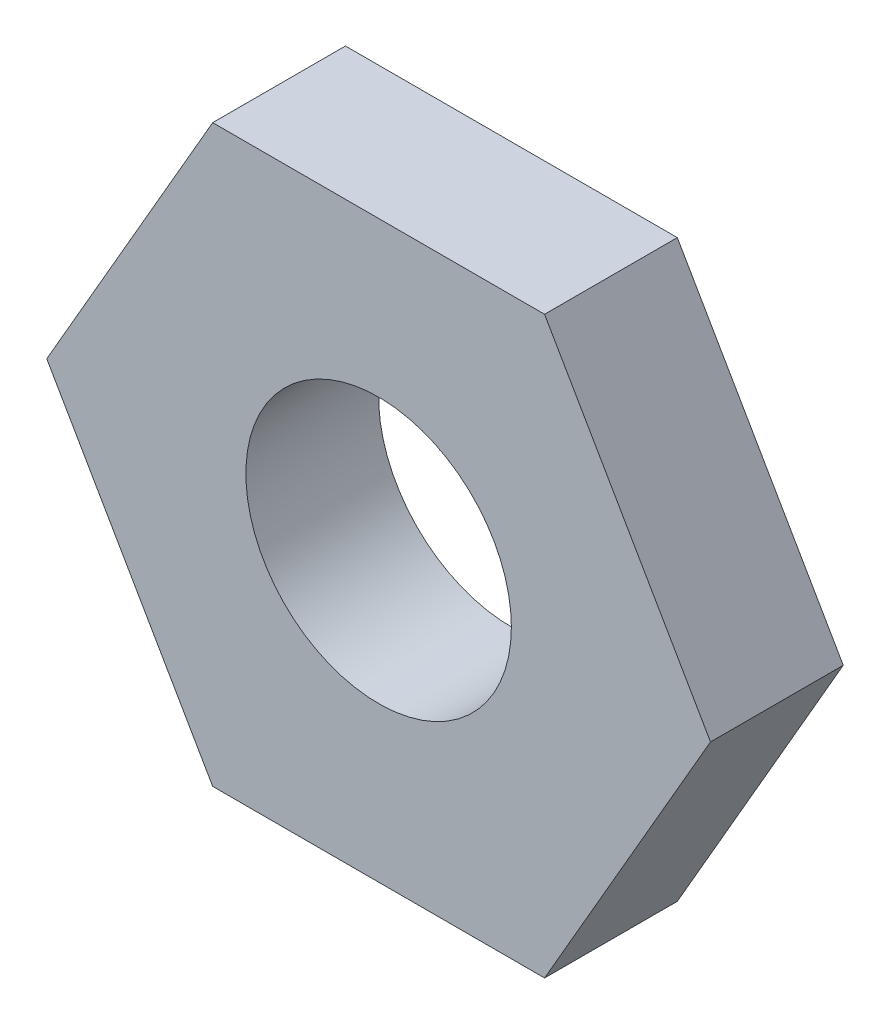
ISO-10303-21;
HEADER;
FILE_DESCRIPTION(('STEP AP214'),'2;1');
FILE_NAME('part.step','',(''),(''),'','','');
FILE_SCHEMA(('AUTOMOTIVE_DESIGN { 1 0 10303 214 1 1 1 1 }'));
ENDSEC;
DATA;
#1=APPLICATION_CONTEXT('core data for automotive mechanical design processes');
#2=APPLICATION_PROTOCOL_DEFINITION('international standard','automotive_design',2000,#1);
#3=PRODUCT_CONTEXT('',#1,'mechanical');
#4=PRODUCT('Part','Part','',(#3));
#5=PRODUCT_RELATED_PRODUCT_CATEGORY('part','',(#4));
#6=PRODUCT_DEFINITION_FORMATION('','',#4);
#7=PRODUCT_DEFINITION_CONTEXT('part definition',#1,'design');
#8=PRODUCT_DEFINITION('design','',#6,#7);
#9=PRODUCT_DEFINITION_SHAPE('','',#8);
#10=(LENGTH_UNIT() NAMED_UNIT(*) SI_UNIT(.MILLI.,.METRE.));
#11=(NAMED_UNIT(*) PLANE_ANGLE_UNIT() SI_UNIT($,.RADIAN.));
#12=(NAMED_UNIT(*) SI_UNIT($,.STERADIAN.) SOLID_ANGLE_UNIT());
#13=UNCERTAINTY_MEASURE_WITH_UNIT(LENGTH_MEASURE(1.E-05),#10,'distance_accuracy_value','');
#14=(GEOMETRIC_REPRESENTATION_CONTEXT(3) GLOBAL_UNCERTAINTY_ASSIGNED_CONTEXT((#13)) GLOBAL_UNIT_ASSIGNED_CONTEXT((#10,
#11,#12)) REPRESENTATION_CONTEXT('',''));
#15=CARTESIAN_POINT('',(0.,0.,0.));
#16=DIRECTION('',(0.,0.,1.));
#17=DIRECTION('',(1.,0.,0.));
#18=AXIS2_PLACEMENT_3D('',#15,#16,#17);
#19=CARTESIAN_POINT('',(10.,0.,4.));
#20=DIRECTION('',(-0.866025403784439,-0.5,0.));
#21=DIRECTION('',(0.5,-0.866025403784439,0.));
#22=AXIS2_PLACEMENT_3D('',#19,#20,#21);
#23=PLANE('',#22);
#24=DIRECTION('',(-0.5,0.866025403784439,0.));
#25=VECTOR('',#24,1.);
#26=CARTESIAN_POINT('',(10.,0.,0.));
#27=LINE('',#26,#25);
#28=CARTESIAN_POINT('',(10.,0.,0.));
#29=VERTEX_POINT('',#28);
#30=CARTESIAN_POINT('',(5.,8.66025403784439,0.));
#31=VERTEX_POINT('',#30);
#32=EDGE_CURVE('E121',#29,#31,#27,.T.);
#33=ORIENTED_EDGE('',*,*,#32,.T.);
#34=DIRECTION('',(0.,0.,-1.));
#35=VECTOR('',#34,1.);
#36=CARTESIAN_POINT('',(5.,8.66025403784439,4.));
#37=LINE('',#36,#35);
#38=CARTESIAN_POINT('',(5.,8.66025403784439,4.));
#39=VERTEX_POINT('',#38);
#40=EDGE_CURVE('E11',#39,#31,#37,.T.);
#41=ORIENTED_EDGE('',*,*,#40,.F.);
#42=DIRECTION('',(-0.5,0.866025403784439,0.));
#43=VECTOR('',#42,1.);
#44=CARTESIAN_POINT('',(10.,0.,4.));
#45=LINE('',#44,#43);
#46=CARTESIAN_POINT('',(10.,0.,4.));
#47=VERTEX_POINT('',#46);
#48=EDGE_CURVE('E132',#47,#39,#45,.T.);
#49=ORIENTED_EDGE('',*,*,#48,.F.);
#50=DIRECTION('',(0.,0.,-1.));
#51=VECTOR('',#50,1.);
#52=CARTESIAN_POINT('',(10.,0.,4.));
#53=LINE('',#52,#51);
#54=EDGE_CURVE('E117',#47,#29,#53,.T.);
#55=ORIENTED_EDGE('',*,*,#54,.T.);
#56=EDGE_LOOP('',(#33,#41,#49,#55));
#57=FACE_BOUND('',#56,.T.);
#58=ADVANCED_FACE('F37',(#57),#23,.F.);
#59=CARTESIAN_POINT('',(5.,8.66025403784439,4.));
#60=DIRECTION('',(0.,-1.,0.));
#61=DIRECTION('',(0.,0.,-1.));
#62=AXIS2_PLACEMENT_3D('',#59,#60,#61);
#63=PLANE('',#62);
#64=DIRECTION('',(-1.,0.,0.));
#65=VECTOR('',#64,1.);
#66=CARTESIAN_POINT('',(5.,8.66025403784439,0.));
#67=LINE('',#66,#65);
#68=CARTESIAN_POINT('',(-5.,8.66025403784439,0.));
#69=VERTEX_POINT('',#68);
#70=EDGE_CURVE('E124',#31,#69,#67,.T.);
#71=ORIENTED_EDGE('',*,*,#70,.T.);
#72=DIRECTION('',(0.,0.,-1.));
#73=VECTOR('',#72,1.);
#74=CARTESIAN_POINT('',(-5.,8.66025403784439,4.));
#75=LINE('',#74,#73);
#76=CARTESIAN_POINT('',(-5.,8.66025403784439,4.));
#77=VERTEX_POINT('',#76);
#78=EDGE_CURVE('E45',#77,#69,#75,.T.);
#79=ORIENTED_EDGE('',*,*,#78,.F.);
#80=DIRECTION('',(-1.,0.,0.));
#81=VECTOR('',#80,1.);
#82=CARTESIAN_POINT('',(5.,8.66025403784439,4.));
#83=LINE('',#82,#81);
#84=EDGE_CURVE('E90',#39,#77,#83,.T.);
#85=ORIENTED_EDGE('',*,*,#84,.F.);
#86=ORIENTED_EDGE('',*,*,#40,.T.);
#87=EDGE_LOOP('',(#71,#79,#85,#86));
#88=FACE_BOUND('',#87,.T.);
#89=ADVANCED_FACE('F157',(#88),#63,.F.);
#90=CARTESIAN_POINT('',(-5.,8.66025403784439,4.));
#91=DIRECTION('',(0.866025403784439,-0.5,0.));
#92=DIRECTION('',(0.5,0.866025403784439,0.));
#93=AXIS2_PLACEMENT_3D('',#90,#91,#92);
#94=PLANE('',#93);
#95=DIRECTION('',(-0.5,-0.866025403784439,0.));
#96=VECTOR('',#95,1.);
#97=CARTESIAN_POINT('',(-5.,8.66025403784439,0.));
#98=LINE('',#97,#96);
#99=CARTESIAN_POINT('',(-10.,0.,0.));
#100=VERTEX_POINT('',#99);
#101=EDGE_CURVE('E127',#69,#100,#98,.T.);
#102=ORIENTED_EDGE('',*,*,#101,.T.);
#103=DIRECTION('',(0.,0.,-1.));
#104=VECTOR('',#103,1.);
#105=CARTESIAN_POINT('',(-10.,0.,4.));
#106=LINE('',#105,#104);
#107=CARTESIAN_POINT('',(-10.,0.,4.));
#108=VERTEX_POINT('',#107);
#109=EDGE_CURVE('E112',#108,#100,#106,.T.);
#110=ORIENTED_EDGE('',*,*,#109,.F.);
#111=DIRECTION('',(-0.5,-0.866025403784439,0.));
#112=VECTOR('',#111,1.);
#113=CARTESIAN_POINT('',(-5.,8.66025403784439,4.));
#114=LINE('',#113,#112);
#115=EDGE_CURVE('E103',#77,#108,#114,.T.);
#116=ORIENTED_EDGE('',*,*,#115,.F.);
#117=ORIENTED_EDGE('',*,*,#78,.T.);
#118=EDGE_LOOP('',(#102,#110,#116,#117));
#119=FACE_BOUND('',#118,.T.);
#120=ADVANCED_FACE('F138',(#119),#94,.F.);
#121=CARTESIAN_POINT('',(-10.,0.,4.));
#122=DIRECTION('',(0.866025403784438,0.5,0.));
#123=DIRECTION('',(-0.5,0.866025403784438,0.));
#124=AXIS2_PLACEMENT_3D('',#121,#122,#123);
#125=PLANE('',#124);
#126=DIRECTION('',(0.5,-0.866025403784438,0.));
#127=VECTOR('',#126,1.);
#128=CARTESIAN_POINT('',(-10.,0.,0.));
#129=LINE('',#128,#127);
#130=CARTESIAN_POINT('',(-4.99999999999999,-8.6602540378444,0.));
#131=VERTEX_POINT('',#130);
#132=EDGE_CURVE('E111',#100,#131,#129,.T.);
#133=ORIENTED_EDGE('',*,*,#132,.T.);
#134=DIRECTION('',(0.,0.,-1.));
#135=VECTOR('',#134,1.);
#136=CARTESIAN_POINT('',(-4.99999999999999,-8.6602540378444,4.));
#137=LINE('',#136,#135);
#138=CARTESIAN_POINT('',(-4.99999999999999,-8.6602540378444,4.));
#139=VERTEX_POINT('',#138);
#140=EDGE_CURVE('E108',#139,#131,#137,.T.);
#141=ORIENTED_EDGE('',*,*,#140,.F.);
#142=DIRECTION('',(0.5,-0.866025403784438,0.));
#143=VECTOR('',#142,1.);
#144=CARTESIAN_POINT('',(-10.,0.,4.));
#145=LINE('',#144,#143);
#146=EDGE_CURVE('E97',#108,#139,#145,.T.);
#147=ORIENTED_EDGE('',*,*,#146,.F.);
#148=ORIENTED_EDGE('',*,*,#109,.T.);
#149=EDGE_LOOP('',(#133,#141,#147,#148));
#150=FACE_BOUND('',#149,.T.);
#151=ADVANCED_FACE('F109',(#150),#125,.F.);
#152=CARTESIAN_POINT('',(-4.99999999999999,-8.6602540378444,4.));
#153=DIRECTION('',(0.,1.,0.));
#154=DIRECTION('',(-1.,0.,0.));
#155=AXIS2_PLACEMENT_3D('',#152,#153,#154);
#156=PLANE('',#155);
#157=DIRECTION('',(1.,0.,0.));
#158=VECTOR('',#157,1.);
#159=CARTESIAN_POINT('',(-4.99999999999999,-8.6602540378444,0.));
#160=LINE('',#159,#158);
#161=CARTESIAN_POINT('',(5.,-8.66025403784439,0.));
#162=VERTEX_POINT('',#161);
#163=EDGE_CURVE('E76',#131,#162,#160,.T.);
#164=ORIENTED_EDGE('',*,*,#163,.T.);
#165=DIRECTION('',(0.,0.,-1.));
#166=VECTOR('',#165,1.);
#167=CARTESIAN_POINT('',(5.,-8.66025403784439,4.));
#168=LINE('',#167,#166);
#169=CARTESIAN_POINT('',(5.,-8.66025403784439,4.));
#170=VERTEX_POINT('',#169);
#171=EDGE_CURVE('E113',#170,#162,#168,.T.);
#172=ORIENTED_EDGE('',*,*,#171,.F.);
#173=DIRECTION('',(1.,0.,0.));
#174=VECTOR('',#173,1.);
#175=CARTESIAN_POINT('',(-4.99999999999999,-8.6602540378444,4.));
#176=LINE('',#175,#174);
#177=EDGE_CURVE('E101',#139,#170,#176,.T.);
#178=ORIENTED_EDGE('',*,*,#177,.F.);
#179=ORIENTED_EDGE('',*,*,#140,.T.);
#180=EDGE_LOOP('',(#164,#172,#178,#179));
#181=FACE_BOUND('',#180,.T.);
#182=ADVANCED_FACE('F115',(#181),#156,.F.);
#183=CARTESIAN_POINT('',(5.,-8.66025403784439,4.));
#184=DIRECTION('',(-0.866025403784439,0.5,0.));
#185=DIRECTION('',(-0.5,-0.866025403784439,0.));
#186=AXIS2_PLACEMENT_3D('',#183,#184,#185);
#187=PLANE('',#186);
#188=DIRECTION('',(0.5,0.866025403784439,0.));
#189=VECTOR('',#188,1.);
#190=CARTESIAN_POINT('',(5.,-8.66025403784439,0.));
#191=LINE('',#190,#189);
#192=EDGE_CURVE('E82',#162,#29,#191,.T.);
#193=ORIENTED_EDGE('',*,*,#192,.T.);
#194=ORIENTED_EDGE('',*,*,#54,.F.);
#195=DIRECTION('',(0.5,0.866025403784439,0.));
#196=VECTOR('',#195,1.);
#197=CARTESIAN_POINT('',(5.,-8.66025403784439,4.));
#198=LINE('',#197,#196);
#199=EDGE_CURVE('E53',#170,#47,#198,.T.);
#200=ORIENTED_EDGE('',*,*,#199,.F.);
#201=ORIENTED_EDGE('',*,*,#171,.T.);
#202=EDGE_LOOP('',(#193,#194,#200,#201));
#203=FACE_BOUND('',#202,.T.);
#204=ADVANCED_FACE('F145',(#203),#187,.F.);
#205=CARTESIAN_POINT('',(5.,8.66025403784439,4.));
#206=DIRECTION('',(0.,0.,1.));
#207=DIRECTION('',(1.,0.,0.));
#208=AXIS2_PLACEMENT_3D('',#205,#206,#207);
#209=PLANE('',#208);
#210=CARTESIAN_POINT('',(0.,0.,4.));
#211=DIRECTION('',(0.,0.,1.));
#212=DIRECTION('',(1.,0.,0.));
#213=AXIS2_PLACEMENT_3D('',#210,#211,#212);
#214=CIRCLE('',#213,4.);
#215=CARTESIAN_POINT('',(4.,0.,4.));
#216=VERTEX_POINT('',#215);
#217=EDGE_CURVE('E244',#216,#216,#214,.T.);
#218=ORIENTED_EDGE('',*,*,#217,.F.);
#219=EDGE_LOOP('',(#218));
#220=FACE_BOUND('',#219,.T.);
#221=ORIENTED_EDGE('',*,*,#48,.T.);
#222=ORIENTED_EDGE('',*,*,#84,.T.);
#223=ORIENTED_EDGE('',*,*,#115,.T.);
#224=ORIENTED_EDGE('',*,*,#146,.T.);
#225=ORIENTED_EDGE('',*,*,#177,.T.);
#226=ORIENTED_EDGE('',*,*,#199,.T.);
#227=EDGE_LOOP('',(#221,#222,#223,#224,#225,#226));
#228=FACE_BOUND('',#227,.T.);
#229=ADVANCED_FACE('F99',(#220,#228),#209,.T.);
#230=CARTESIAN_POINT('',(5.,8.66025403784439,0.));
#231=DIRECTION('',(0.,0.,1.));
#232=DIRECTION('',(1.,0.,0.));
#233=AXIS2_PLACEMENT_3D('',#230,#231,#232);
#234=PLANE('',#233);
#235=CARTESIAN_POINT('',(0.,0.,0.));
#236=DIRECTION('',(0.,0.,1.));
#237=DIRECTION('',(1.,0.,0.));
#238=AXIS2_PLACEMENT_3D('',#235,#236,#237);
#239=CIRCLE('',#238,4.);
#240=CARTESIAN_POINT('',(4.,0.,0.));
#241=VERTEX_POINT('',#240);
#242=EDGE_CURVE('E125',#241,#241,#239,.T.);
#243=ORIENTED_EDGE('',*,*,#242,.T.);
#244=EDGE_LOOP('',(#243));
#245=FACE_BOUND('',#244,.T.);
#246=ORIENTED_EDGE('',*,*,#32,.F.);
#247=ORIENTED_EDGE('',*,*,#192,.F.);
#248=ORIENTED_EDGE('',*,*,#163,.F.);
#249=ORIENTED_EDGE('',*,*,#132,.F.);
#250=ORIENTED_EDGE('',*,*,#101,.F.);
#251=ORIENTED_EDGE('',*,*,#70,.F.);
#252=EDGE_LOOP('',(#246,#247,#248,#249,#250,#251));
#253=FACE_BOUND('',#252,.T.);
#254=ADVANCED_FACE('F141',(#245,#253),#234,.F.);
#255=CARTESIAN_POINT('',(0.,0.,0.));
#256=DIRECTION('',(0.,0.,1.));
#257=DIRECTION('',(1.,0.,0.));
#258=AXIS2_PLACEMENT_3D('',#255,#256,#257);
#259=CYLINDRICAL_SURFACE('',#258,4.);
#260=ORIENTED_EDGE('',*,*,#242,.F.);
#261=EDGE_LOOP('',(#260));
#262=FACE_BOUND('',#261,.T.);
#263=ORIENTED_EDGE('',*,*,#217,.T.);
#264=EDGE_LOOP('',(#263));
#265=FACE_BOUND('',#264,.T.);
#266=ADVANCED_FACE('F197',(#262,#265),#259,.F.);
#267=CLOSED_SHELL('',(#58,#89,#120,#151,#182,#204,#229,#254,#266));
#268=MANIFOLD_SOLID_BREP('B2',#267);
#269=ADVANCED_BREP_SHAPE_REPRESENTATION('',(#18,#268),#14);
#270=SHAPE_DEFINITION_REPRESENTATION(#9,#269);
ENDSEC;
END-ISO-10303-21;
